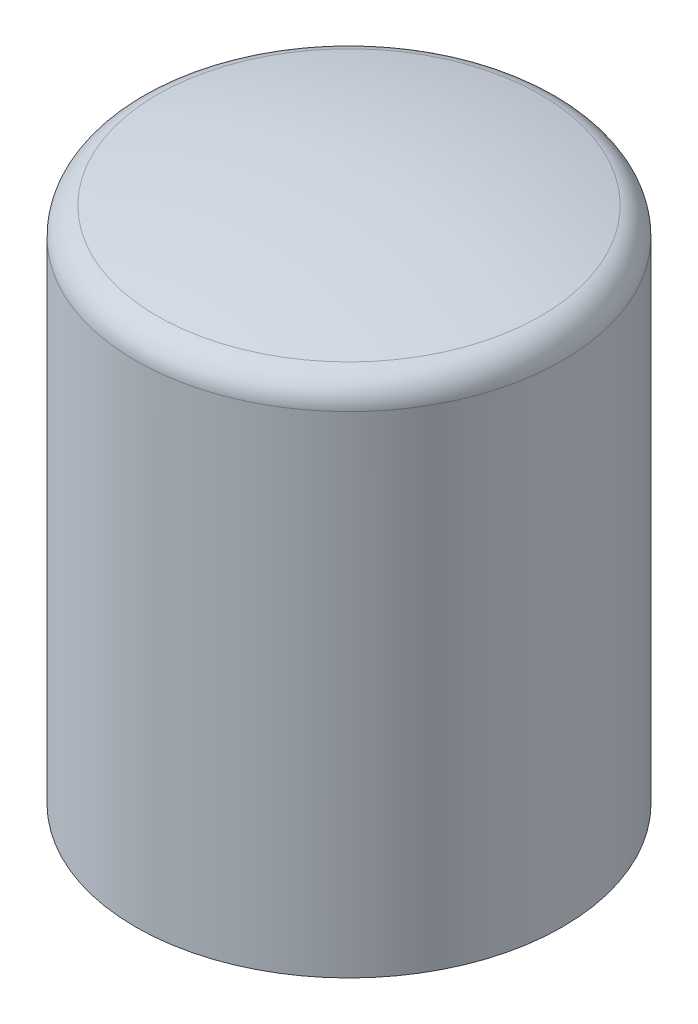
ISO-10303-21;
HEADER;
FILE_DESCRIPTION(('STEP AP214'),'2;1');
FILE_NAME('part.step','',(''),(''),'','','');
FILE_SCHEMA(('AUTOMOTIVE_DESIGN { 1 0 10303 214 1 1 1 1 }'));
ENDSEC;
DATA;
#1=APPLICATION_CONTEXT('core data for automotive mechanical design processes');
#2=APPLICATION_PROTOCOL_DEFINITION('international standard','automotive_design',2000,#1);
#3=PRODUCT_CONTEXT('',#1,'mechanical');
#4=PRODUCT('Part','Part','',(#3));
#5=PRODUCT_RELATED_PRODUCT_CATEGORY('part','',(#4));
#6=PRODUCT_DEFINITION_FORMATION('','',#4);
#7=PRODUCT_DEFINITION_CONTEXT('part definition',#1,'design');
#8=PRODUCT_DEFINITION('design','',#6,#7);
#9=PRODUCT_DEFINITION_SHAPE('','',#8);
#10=(LENGTH_UNIT() NAMED_UNIT(*) SI_UNIT(.MILLI.,.METRE.));
#11=(NAMED_UNIT(*) PLANE_ANGLE_UNIT() SI_UNIT($,.RADIAN.));
#12=(NAMED_UNIT(*) SI_UNIT($,.STERADIAN.) SOLID_ANGLE_UNIT());
#13=UNCERTAINTY_MEASURE_WITH_UNIT(LENGTH_MEASURE(1.E-05),#10,'distance_accuracy_value','');
#14=(GEOMETRIC_REPRESENTATION_CONTEXT(3) GLOBAL_UNCERTAINTY_ASSIGNED_CONTEXT((#13)) GLOBAL_UNIT_ASSIGNED_CONTEXT((#10,
#11,#12)) REPRESENTATION_CONTEXT('',''));
#15=CARTESIAN_POINT('',(0.,0.,0.));
#16=DIRECTION('',(0.,0.,1.));
#17=DIRECTION('',(1.,0.,0.));
#18=AXIS2_PLACEMENT_3D('',#15,#16,#17);
#19=CARTESIAN_POINT('',(0.,6.35,0.));
#20=DIRECTION('',(0.,-1.,0.));
#21=DIRECTION('',(0.,0.,-1.));
#22=AXIS2_PLACEMENT_3D('',#19,#20,#21);
#23=CYLINDRICAL_SURFACE('',#22,3.3);
#24=DIRECTION('',(0.,1.,0.));
#25=VECTOR('',#24,1.);
#26=CARTESIAN_POINT('',(2.56,-4.4199547508996,-2.08240245870005));
#27=LINE('',#26,#25);
#28=CARTESIAN_POINT('',(2.56,0.,-2.08240245870005));
#29=VERTEX_POINT('',#28);
#30=CARTESIAN_POINT('',(2.56,6.35,-2.08240245870005));
#31=VERTEX_POINT('',#30);
#32=EDGE_CURVE('E62',#29,#31,#27,.T.);
#33=ORIENTED_EDGE('',*,*,#32,.T.);
#34=CARTESIAN_POINT('',(0.,6.35,0.));
#35=DIRECTION('',(0.,-1.,0.));
#36=DIRECTION('',(0.,0.,-1.));
#37=AXIS2_PLACEMENT_3D('',#34,#35,#36);
#38=CIRCLE('',#37,3.3);
#39=CARTESIAN_POINT('',(2.56,6.35,2.08240245870005));
#40=VERTEX_POINT('',#39);
#41=EDGE_CURVE('E69',#40,#31,#38,.T.);
#42=ORIENTED_EDGE('',*,*,#41,.F.);
#43=DIRECTION('',(0.,1.,0.));
#44=VECTOR('',#43,1.);
#45=CARTESIAN_POINT('',(2.56,-4.4199547508996,2.08240245870005));
#46=LINE('',#45,#44);
#47=CARTESIAN_POINT('',(2.56,0.,2.08240245870005));
#48=VERTEX_POINT('',#47);
#49=EDGE_CURVE('E50',#48,#40,#46,.T.);
#50=ORIENTED_EDGE('',*,*,#49,.F.);
#51=CARTESIAN_POINT('',(0.,0.,0.));
#52=DIRECTION('',(0.,-1.,0.));
#53=DIRECTION('',(0.,0.,-1.));
#54=AXIS2_PLACEMENT_3D('',#51,#52,#53);
#55=CIRCLE('',#54,3.3);
#56=EDGE_CURVE('E71',#48,#29,#55,.T.);
#57=ORIENTED_EDGE('',*,*,#56,.T.);
#58=EDGE_LOOP('',(#33,#42,#50,#57));
#59=FACE_BOUND('',#58,.T.);
#60=ADVANCED_FACE('F35',(#59),#23,.F.);
#61=CARTESIAN_POINT('',(0.,6.35,0.));
#62=DIRECTION('',(0.,-1.,0.));
#63=DIRECTION('',(0.,0.,-1.));
#64=AXIS2_PLACEMENT_3D('',#61,#62,#63);
#65=PLANE('',#64);
#66=ORIENTED_EDGE('',*,*,#41,.T.);
#67=DIRECTION('',(0.,0.,-1.));
#68=VECTOR('',#67,1.);
#69=CARTESIAN_POINT('',(2.56,6.35,2.08240245870005));
#70=LINE('',#69,#68);
#71=EDGE_CURVE('E59',#40,#31,#70,.T.);
#72=ORIENTED_EDGE('',*,*,#71,.F.);
#73=EDGE_LOOP('',(#66,#72));
#74=FACE_BOUND('',#73,.T.);
#75=ADVANCED_FACE('F73',(#74),#65,.T.);
#76=CARTESIAN_POINT('',(0.,18.,0.));
#77=DIRECTION('',(0.,-1.,0.));
#78=DIRECTION('',(0.,0.,-1.));
#79=AXIS2_PLACEMENT_3D('',#76,#77,#78);
#80=CYLINDRICAL_SURFACE('',#79,7.5);
#81=CARTESIAN_POINT('',(0.,17.2244064180197,0.));
#82=DIRECTION('',(0.,-1.,0.));
#83=DIRECTION('',(0.,0.,-1.));
#84=AXIS2_PLACEMENT_3D('',#81,#82,#83);
#85=CIRCLE('',#84,7.5);
#86=CARTESIAN_POINT('',(0.,17.2244064180197,-7.5));
#87=VERTEX_POINT('',#86);
#88=EDGE_CURVE('E11',#87,#87,#85,.T.);
#89=ORIENTED_EDGE('',*,*,#88,.T.);
#90=EDGE_LOOP('',(#89));
#91=FACE_BOUND('',#90,.T.);
#92=CARTESIAN_POINT('',(0.,0.,0.));
#93=DIRECTION('',(0.,1.,0.));
#94=DIRECTION('',(0.,0.,1.));
#95=AXIS2_PLACEMENT_3D('',#92,#93,#94);
#96=CIRCLE('',#95,7.5);
#97=CARTESIAN_POINT('',(0.,0.,7.5));
#98=VERTEX_POINT('',#97);
#99=EDGE_CURVE('E74',#98,#98,#96,.T.);
#100=ORIENTED_EDGE('',*,*,#99,.T.);
#101=EDGE_LOOP('',(#100));
#102=FACE_BOUND('',#101,.T.);
#103=ADVANCED_FACE('F101',(#91,#102),#80,.T.);
#104=CARTESIAN_POINT('',(0.,-9.62499999999998,0.));
#105=DIRECTION('',(0.,0.,1.));
#106=DIRECTION('',(1.,0.,0.));
#107=AXIS2_PLACEMENT_3D('',#104,#105,#106);
#108=SPHERICAL_SURFACE('',#107,28.625);
#109=CARTESIAN_POINT('',(0.,-9.62499999999998,0.));
#110=DIRECTION('',(0.,-1.,0.));
#111=DIRECTION('',(0.,0.,-1.));
#112=AXIS2_PLACEMENT_3D('',#109,#110,#111);
#113=SPHERICAL_SURFACE('',#112,28.625);
#114=CARTESIAN_POINT('',(0.,18.1963306322467,0.));
#115=DIRECTION('',(0.,-1.,0.));
#116=DIRECTION('',(0.,0.,-1.));
#117=AXIS2_PLACEMENT_3D('',#114,#115,#116);
#118=CIRCLE('',#117,6.73529411764706);
#119=CARTESIAN_POINT('',(0.,18.1963306322467,-6.73529411764706));
#120=VERTEX_POINT('',#119);
#121=EDGE_CURVE('E43',#120,#120,#118,.F.);
#122=ORIENTED_EDGE('',*,*,#121,.T.);
#123=EDGE_LOOP('',(#122));
#124=FACE_BOUND('',#123,.T.);
#125=ADVANCED_FACE('F83',(#124),#113,.T.);
#126=CARTESIAN_POINT('',(0.,0.,0.));
#127=DIRECTION('',(0.,1.,0.));
#128=DIRECTION('',(0.,0.,1.));
#129=AXIS2_PLACEMENT_3D('',#126,#127,#128);
#130=PLANE('',#129);
#131=ORIENTED_EDGE('',*,*,#56,.F.);
#132=DIRECTION('',(0.,0.,1.));
#133=VECTOR('',#132,1.);
#134=CARTESIAN_POINT('',(2.56,0.,2.08240245870005));
#135=LINE('',#134,#133);
#136=EDGE_CURVE('E55',#29,#48,#135,.T.);
#137=ORIENTED_EDGE('',*,*,#136,.F.);
#138=EDGE_LOOP('',(#131,#137));
#139=FACE_BOUND('',#138,.T.);
#140=ORIENTED_EDGE('',*,*,#99,.F.);
#141=EDGE_LOOP('',(#140));
#142=FACE_BOUND('',#141,.T.);
#143=ADVANCED_FACE('F86',(#139,#142),#130,.F.);
#144=CARTESIAN_POINT('',(0.,17.2244064180197,0.));
#145=DIRECTION('',(0.,-1.,0.));
#146=DIRECTION('',(0.,0.,-1.));
#147=AXIS2_PLACEMENT_3D('',#144,#145,#146);
#148=TOROIDAL_SURFACE('',#147,6.5,1.);
#149=ORIENTED_EDGE('',*,*,#88,.F.);
#150=EDGE_LOOP('',(#149));
#151=FACE_BOUND('',#150,.T.);
#152=ORIENTED_EDGE('',*,*,#121,.F.);
#153=EDGE_LOOP('',(#152));
#154=FACE_BOUND('',#153,.T.);
#155=ADVANCED_FACE('F37',(#151,#154),#148,.T.);
#156=CARTESIAN_POINT('',(2.56,-4.4199547508996,2.08240245870005));
#157=DIRECTION('',(1.,0.,0.));
#158=DIRECTION('',(0.,0.,-1.));
#159=AXIS2_PLACEMENT_3D('',#156,#157,#158);
#160=PLANE('',#159);
#161=ORIENTED_EDGE('',*,*,#32,.F.);
#162=ORIENTED_EDGE('',*,*,#136,.T.);
#163=ORIENTED_EDGE('',*,*,#49,.T.);
#164=ORIENTED_EDGE('',*,*,#71,.T.);
#165=EDGE_LOOP('',(#161,#162,#163,#164));
#166=FACE_BOUND('',#165,.T.);
#167=ADVANCED_FACE('F61',(#166),#160,.F.);
#168=CLOSED_SHELL('',(#60,#75,#103,#125,#143,#155,#167));
#169=MANIFOLD_SOLID_BREP('B2',#168);
#170=ADVANCED_BREP_SHAPE_REPRESENTATION('',(#18,#169),#14);
#171=SHAPE_DEFINITION_REPRESENTATION(#9,#170);
ENDSEC;
END-ISO-10303-21;
